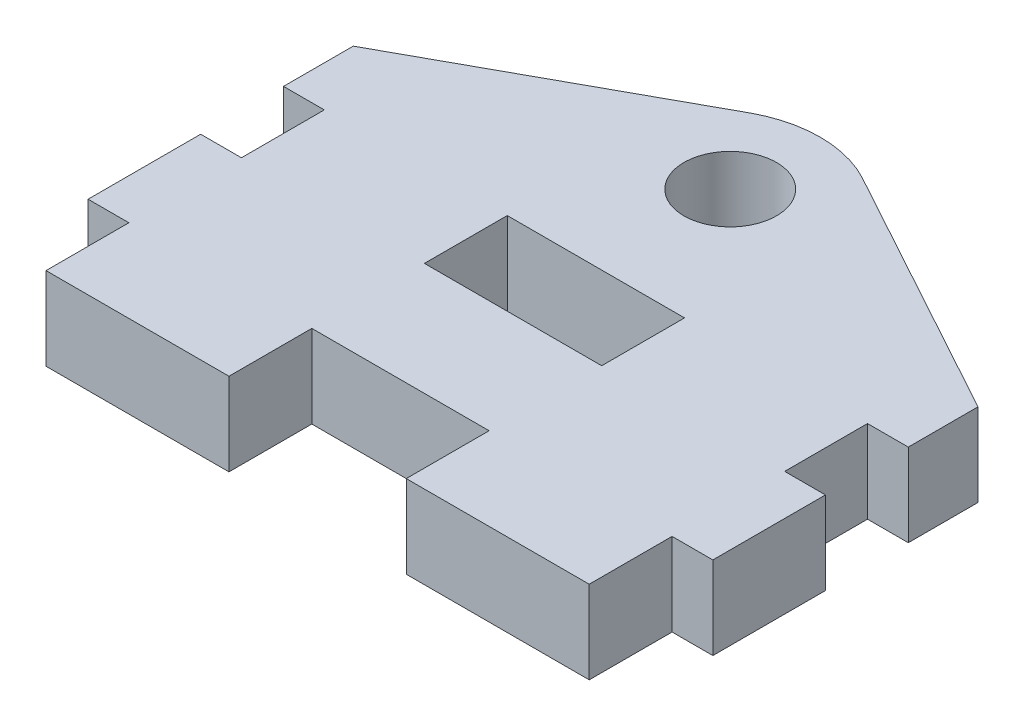
ISO-10303-21;
HEADER;
FILE_DESCRIPTION(('STEP AP214'),'2;1');
FILE_NAME('part.step','',(''),(''),'','','');
FILE_SCHEMA(('AUTOMOTIVE_DESIGN { 1 0 10303 214 1 1 1 1 }'));
ENDSEC;
DATA;
#1=APPLICATION_CONTEXT('core data for automotive mechanical design processes');
#2=APPLICATION_PROTOCOL_DEFINITION('international standard','automotive_design',2000,#1);
#3=PRODUCT_CONTEXT('',#1,'mechanical');
#4=PRODUCT('Part','Part','',(#3));
#5=PRODUCT_RELATED_PRODUCT_CATEGORY('part','',(#4));
#6=PRODUCT_DEFINITION_FORMATION('','',#4);
#7=PRODUCT_DEFINITION_CONTEXT('part definition',#1,'design');
#8=PRODUCT_DEFINITION('design','',#6,#7);
#9=PRODUCT_DEFINITION_SHAPE('','',#8);
#10=(LENGTH_UNIT() NAMED_UNIT(*) SI_UNIT(.MILLI.,.METRE.));
#11=(NAMED_UNIT(*) PLANE_ANGLE_UNIT() SI_UNIT($,.RADIAN.));
#12=(NAMED_UNIT(*) SI_UNIT($,.STERADIAN.) SOLID_ANGLE_UNIT());
#13=UNCERTAINTY_MEASURE_WITH_UNIT(LENGTH_MEASURE(1.E-05),#10,'distance_accuracy_value','');
#14=(GEOMETRIC_REPRESENTATION_CONTEXT(3) GLOBAL_UNCERTAINTY_ASSIGNED_CONTEXT((#13)) GLOBAL_UNIT_ASSIGNED_CONTEXT((#10,
#11,#12)) REPRESENTATION_CONTEXT('',''));
#15=CARTESIAN_POINT('',(0.,0.,0.));
#16=DIRECTION('',(0.,0.,1.));
#17=DIRECTION('',(1.,0.,0.));
#18=AXIS2_PLACEMENT_3D('',#15,#16,#17);
#19=CARTESIAN_POINT('',(-25.6,5.842,-21.2852032988051));
#20=DIRECTION('',(0.,-1.,0.));
#21=DIRECTION('',(0.,0.,-1.));
#22=AXIS2_PLACEMENT_3D('',#19,#20,#21);
#23=PLANE('',#22);
#24=CARTESIAN_POINT('',(-25.6,5.842,-23.2513391840755));
#25=DIRECTION('',(0.,1.,0.));
#26=DIRECTION('',(0.,0.,1.));
#27=AXIS2_PLACEMENT_3D('',#24,#25,#26);
#28=CIRCLE('',#27,3.26389999999999);
#29=CARTESIAN_POINT('',(-25.6,5.842,-19.9874391840755));
#30=VERTEX_POINT('',#29);
#31=EDGE_CURVE('E386',#30,#30,#28,.T.);
#32=ORIENTED_EDGE('',*,*,#31,.F.);
#33=EDGE_LOOP('',(#32));
#34=FACE_BOUND('',#33,.T.);
#35=DIRECTION('',(1.,0.,0.));
#36=VECTOR('',#35,1.);
#37=CARTESIAN_POINT('',(-0.400000000000005,5.842,-13.7795));
#38=LINE('',#37,#36);
#39=CARTESIAN_POINT('',(-6.45,5.842,-13.7795));
#40=VERTEX_POINT('',#39);
#41=CARTESIAN_POINT('',(-3.57499999999999,5.842,-13.7795));
#42=VERTEX_POINT('',#41);
#43=EDGE_CURVE('E352',#40,#42,#38,.T.);
#44=ORIENTED_EDGE('',*,*,#43,.T.);
#45=DIRECTION('',(0.,0.,1.));
#46=VECTOR('',#45,1.);
#47=CARTESIAN_POINT('',(-3.57499999999999,5.842,-13.7795));
#48=LINE('',#47,#46);
#49=CARTESIAN_POINT('',(-3.57499999999999,5.842,-18.6950088034694));
#50=VERTEX_POINT('',#49);
#51=EDGE_CURVE('E205',#50,#42,#48,.T.);
#52=ORIENTED_EDGE('',*,*,#51,.F.);
#53=DIRECTION('',(-0.876884617743926,0.,-0.480700912381169));
#54=VECTOR('',#53,1.);
#55=CARTESIAN_POINT('',(-0.400000000000005,5.842,-16.9545));
#56=LINE('',#55,#54);
#57=CARTESIAN_POINT('',(-21.6024258924648,5.842,-28.577494935667));
#58=VERTEX_POINT('',#57);
#59=EDGE_CURVE('E350',#50,#58,#56,.T.);
#60=ORIENTED_EDGE('',*,*,#59,.T.);
#61=CARTESIAN_POINT('',(-25.6,5.842,-21.2852032988051));
#62=DIRECTION('',(0.,1.,0.));
#63=DIRECTION('',(0.,0.,-1.));
#64=AXIS2_PLACEMENT_3D('',#61,#62,#63);
#65=CIRCLE('',#64,8.31613588527039);
#66=CARTESIAN_POINT('',(-29.5975741075352,5.842,-28.577494935667));
#67=VERTEX_POINT('',#66);
#68=EDGE_CURVE('E348',#58,#67,#65,.T.);
#69=ORIENTED_EDGE('',*,*,#68,.T.);
#70=DIRECTION('',(-0.876884617743927,0.,0.480700912381168));
#71=VECTOR('',#70,1.);
#72=CARTESIAN_POINT('',(-50.8,5.842,-16.9545));
#73=LINE('',#72,#71);
#74=CARTESIAN_POINT('',(-47.625,5.842,-18.6950088034694));
#75=VERTEX_POINT('',#74);
#76=EDGE_CURVE('E345',#67,#75,#73,.T.);
#77=ORIENTED_EDGE('',*,*,#76,.T.);
#78=DIRECTION('',(0.,0.,-1.));
#79=VECTOR('',#78,1.);
#80=CARTESIAN_POINT('',(-47.625,5.842,-13.7795));
#81=LINE('',#80,#79);
#82=CARTESIAN_POINT('',(-47.625,5.842,-13.7795));
#83=VERTEX_POINT('',#82);
#84=EDGE_CURVE('E210',#83,#75,#81,.T.);
#85=ORIENTED_EDGE('',*,*,#84,.F.);
#86=DIRECTION('',(1.,0.,0.));
#87=VECTOR('',#86,1.);
#88=CARTESIAN_POINT('',(-44.75,5.842,-13.7795));
#89=LINE('',#88,#87);
#90=CARTESIAN_POINT('',(-44.75,5.842,-13.7795));
#91=VERTEX_POINT('',#90);
#92=EDGE_CURVE('E343',#83,#91,#89,.T.);
#93=ORIENTED_EDGE('',*,*,#92,.T.);
#94=DIRECTION('',(0.,0.,1.));
#95=VECTOR('',#94,1.);
#96=CARTESIAN_POINT('',(-44.75,5.842,-7.9375));
#97=LINE('',#96,#95);
#98=CARTESIAN_POINT('',(-44.75,5.842,-7.9375));
#99=VERTEX_POINT('',#98);
#100=EDGE_CURVE('E341',#91,#99,#97,.T.);
#101=ORIENTED_EDGE('',*,*,#100,.T.);
#102=DIRECTION('',(-1.,0.,0.));
#103=VECTOR('',#102,1.);
#104=CARTESIAN_POINT('',(-44.75,5.842,-7.9375));
#105=LINE('',#104,#103);
#106=CARTESIAN_POINT('',(-47.625,5.842,-7.93749999999999));
#107=VERTEX_POINT('',#106);
#108=EDGE_CURVE('E338',#99,#107,#105,.T.);
#109=ORIENTED_EDGE('',*,*,#108,.T.);
#110=DIRECTION('',(0.,0.,-1.));
#111=VECTOR('',#110,1.);
#112=CARTESIAN_POINT('',(-47.625,5.842,-7.93749999999999));
#113=LINE('',#112,#111);
#114=CARTESIAN_POINT('',(-47.625,5.842,0.));
#115=VERTEX_POINT('',#114);
#116=EDGE_CURVE('E395',#115,#107,#113,.T.);
#117=ORIENTED_EDGE('',*,*,#116,.F.);
#118=DIRECTION('',(1.,0.,0.));
#119=VECTOR('',#118,1.);
#120=CARTESIAN_POINT('',(-44.75,5.842,0.));
#121=LINE('',#120,#119);
#122=CARTESIAN_POINT('',(-44.75,5.842,0.));
#123=VERTEX_POINT('',#122);
#124=EDGE_CURVE('E336',#115,#123,#121,.T.);
#125=ORIENTED_EDGE('',*,*,#124,.T.);
#126=DIRECTION('',(0.,0.,1.));
#127=VECTOR('',#126,1.);
#128=CARTESIAN_POINT('',(-44.75,5.842,0.));
#129=LINE('',#128,#127);
#130=CARTESIAN_POINT('',(-44.75,5.842,5.842));
#131=VERTEX_POINT('',#130);
#132=EDGE_CURVE('E334',#123,#131,#129,.T.);
#133=ORIENTED_EDGE('',*,*,#132,.T.);
#134=DIRECTION('',(1.,0.,0.));
#135=VECTOR('',#134,1.);
#136=CARTESIAN_POINT('',(-44.75,5.842,5.842));
#137=LINE('',#136,#135);
#138=CARTESIAN_POINT('',(-31.85,5.842,5.842));
#139=VERTEX_POINT('',#138);
#140=EDGE_CURVE('E332',#131,#139,#137,.T.);
#141=ORIENTED_EDGE('',*,*,#140,.T.);
#142=DIRECTION('',(0.,0.,-1.));
#143=VECTOR('',#142,1.);
#144=CARTESIAN_POINT('',(-31.85,5.842,0.));
#145=LINE('',#144,#143);
#146=CARTESIAN_POINT('',(-31.85,5.842,0.));
#147=VERTEX_POINT('',#146);
#148=EDGE_CURVE('E330',#139,#147,#145,.T.);
#149=ORIENTED_EDGE('',*,*,#148,.T.);
#150=DIRECTION('',(1.,0.,0.));
#151=VECTOR('',#150,1.);
#152=CARTESIAN_POINT('',(-19.35,5.842,0.));
#153=LINE('',#152,#151);
#154=CARTESIAN_POINT('',(-19.35,5.842,0.));
#155=VERTEX_POINT('',#154);
#156=EDGE_CURVE('E328',#147,#155,#153,.T.);
#157=ORIENTED_EDGE('',*,*,#156,.T.);
#158=DIRECTION('',(0.,0.,1.));
#159=VECTOR('',#158,1.);
#160=CARTESIAN_POINT('',(-19.35,5.842,0.));
#161=LINE('',#160,#159);
#162=CARTESIAN_POINT('',(-19.35,5.842,5.842));
#163=VERTEX_POINT('',#162);
#164=EDGE_CURVE('E326',#155,#163,#161,.T.);
#165=ORIENTED_EDGE('',*,*,#164,.T.);
#166=DIRECTION('',(1.,0.,0.));
#167=VECTOR('',#166,1.);
#168=CARTESIAN_POINT('',(-6.45,5.842,5.842));
#169=LINE('',#168,#167);
#170=CARTESIAN_POINT('',(-6.45,5.842,5.842));
#171=VERTEX_POINT('',#170);
#172=EDGE_CURVE('E324',#163,#171,#169,.T.);
#173=ORIENTED_EDGE('',*,*,#172,.T.);
#174=DIRECTION('',(0.,0.,-1.));
#175=VECTOR('',#174,1.);
#176=CARTESIAN_POINT('',(-6.45,5.842,0.));
#177=LINE('',#176,#175);
#178=CARTESIAN_POINT('',(-6.45,5.842,0.));
#179=VERTEX_POINT('',#178);
#180=EDGE_CURVE('E322',#171,#179,#177,.T.);
#181=ORIENTED_EDGE('',*,*,#180,.T.);
#182=DIRECTION('',(1.,0.,0.));
#183=VECTOR('',#182,1.);
#184=CARTESIAN_POINT('',(0.,5.842,0.));
#185=LINE('',#184,#183);
#186=CARTESIAN_POINT('',(-3.57500000000001,5.842,0.));
#187=VERTEX_POINT('',#186);
#188=EDGE_CURVE('E269',#179,#187,#185,.T.);
#189=ORIENTED_EDGE('',*,*,#188,.T.);
#190=DIRECTION('',(0.,0.,1.));
#191=VECTOR('',#190,1.);
#192=CARTESIAN_POINT('',(-3.575,5.842,-7.93749999999999));
#193=LINE('',#192,#191);
#194=CARTESIAN_POINT('',(-3.575,5.842,-7.93749999999999));
#195=VERTEX_POINT('',#194);
#196=EDGE_CURVE('E404',#195,#187,#193,.T.);
#197=ORIENTED_EDGE('',*,*,#196,.F.);
#198=DIRECTION('',(-1.,0.,0.));
#199=VECTOR('',#198,1.);
#200=CARTESIAN_POINT('',(0.,5.842,-7.93750000000001));
#201=LINE('',#200,#199);
#202=CARTESIAN_POINT('',(-6.45,5.842,-7.93749999999998));
#203=VERTEX_POINT('',#202);
#204=EDGE_CURVE('E264',#195,#203,#201,.T.);
#205=ORIENTED_EDGE('',*,*,#204,.T.);
#206=DIRECTION('',(0.,0.,-1.));
#207=VECTOR('',#206,1.);
#208=CARTESIAN_POINT('',(-6.45,5.842,-7.93749999999998));
#209=LINE('',#208,#207);
#210=EDGE_CURVE('E307',#203,#40,#209,.T.);
#211=ORIENTED_EDGE('',*,*,#210,.T.);
#212=EDGE_LOOP('',(#44,#52,#60,#69,#77,#85,#93,#101,#109,#117,#125,#133,#141,#149,#157,#165,
#173,#181,#189,#197,#205,#211));
#213=FACE_BOUND('',#212,.T.);
#214=DIRECTION('',(0.,0.,-1.));
#215=VECTOR('',#214,1.);
#216=CARTESIAN_POINT('',(-19.35,5.842,-7.93749999999999));
#217=LINE('',#216,#215);
#218=CARTESIAN_POINT('',(-19.35,5.842,-7.93749999999999));
#219=VERTEX_POINT('',#218);
#220=CARTESIAN_POINT('',(-19.35,5.842,-13.7795));
#221=VERTEX_POINT('',#220);
#222=EDGE_CURVE('E366',#219,#221,#217,.T.);
#223=ORIENTED_EDGE('',*,*,#222,.F.);
#224=DIRECTION('',(1.,0.,0.));
#225=VECTOR('',#224,1.);
#226=CARTESIAN_POINT('',(-19.35,5.842,-7.93749999999999));
#227=LINE('',#226,#225);
#228=CARTESIAN_POINT('',(-31.85,5.842,-7.9375));
#229=VERTEX_POINT('',#228);
#230=EDGE_CURVE('E362',#229,#219,#227,.T.);
#231=ORIENTED_EDGE('',*,*,#230,.F.);
#232=DIRECTION('',(0.,0.,1.));
#233=VECTOR('',#232,1.);
#234=CARTESIAN_POINT('',(-31.85,5.842,-7.9375));
#235=LINE('',#234,#233);
#236=CARTESIAN_POINT('',(-31.85,5.842,-13.7795));
#237=VERTEX_POINT('',#236);
#238=EDGE_CURVE('E378',#237,#229,#235,.T.);
#239=ORIENTED_EDGE('',*,*,#238,.F.);
#240=DIRECTION('',(-1.,0.,0.));
#241=VECTOR('',#240,1.);
#242=CARTESIAN_POINT('',(-19.35,5.842,-13.7795));
#243=LINE('',#242,#241);
#244=EDGE_CURVE('E381',#221,#237,#243,.T.);
#245=ORIENTED_EDGE('',*,*,#244,.F.);
#246=EDGE_LOOP('',(#223,#231,#239,#245));
#247=FACE_BOUND('',#246,.T.);
#248=ADVANCED_FACE('F32',(#34,#213,#247),#23,.F.);
#249=CARTESIAN_POINT('',(-25.6,0.,-21.2852032988051));
#250=DIRECTION('',(0.,-1.,0.));
#251=DIRECTION('',(0.,0.,-1.));
#252=AXIS2_PLACEMENT_3D('',#249,#250,#251);
#253=PLANE('',#252);
#254=DIRECTION('',(0.,0.,1.));
#255=VECTOR('',#254,1.);
#256=CARTESIAN_POINT('',(-3.57499999999999,0.,-13.7795));
#257=LINE('',#256,#255);
#258=CARTESIAN_POINT('',(-3.575,0.,-18.6950088034694));
#259=VERTEX_POINT('',#258);
#260=CARTESIAN_POINT('',(-3.57499999999999,0.,-13.7795));
#261=VERTEX_POINT('',#260);
#262=EDGE_CURVE('E47',#259,#261,#257,.T.);
#263=ORIENTED_EDGE('',*,*,#262,.T.);
#264=DIRECTION('',(1.,0.,0.));
#265=VECTOR('',#264,1.);
#266=CARTESIAN_POINT('',(-0.400000000000005,0.,-13.7795));
#267=LINE('',#266,#265);
#268=CARTESIAN_POINT('',(-6.45,0.,-13.7795));
#269=VERTEX_POINT('',#268);
#270=EDGE_CURVE('E218',#269,#261,#267,.T.);
#271=ORIENTED_EDGE('',*,*,#270,.F.);
#272=DIRECTION('',(0.,0.,-1.));
#273=VECTOR('',#272,1.);
#274=CARTESIAN_POINT('',(-6.45,0.,-7.93749999999998));
#275=LINE('',#274,#273);
#276=CARTESIAN_POINT('',(-6.45,0.,-7.93749999999998));
#277=VERTEX_POINT('',#276);
#278=EDGE_CURVE('E226',#277,#269,#275,.T.);
#279=ORIENTED_EDGE('',*,*,#278,.F.);
#280=DIRECTION('',(-1.,0.,0.));
#281=VECTOR('',#280,1.);
#282=CARTESIAN_POINT('',(0.,0.,-7.93750000000001));
#283=LINE('',#282,#281);
#284=CARTESIAN_POINT('',(-3.575,0.,-7.93749999999999));
#285=VERTEX_POINT('',#284);
#286=EDGE_CURVE('E230',#285,#277,#283,.T.);
#287=ORIENTED_EDGE('',*,*,#286,.F.);
#288=DIRECTION('',(0.,0.,1.));
#289=VECTOR('',#288,1.);
#290=CARTESIAN_POINT('',(-3.575,0.,-7.93749999999999));
#291=LINE('',#290,#289);
#292=CARTESIAN_POINT('',(-3.57500000000001,0.,0.));
#293=VERTEX_POINT('',#292);
#294=EDGE_CURVE('E313',#285,#293,#291,.T.);
#295=ORIENTED_EDGE('',*,*,#294,.T.);
#296=DIRECTION('',(1.,0.,0.));
#297=VECTOR('',#296,1.);
#298=CARTESIAN_POINT('',(0.,0.,0.));
#299=LINE('',#298,#297);
#300=CARTESIAN_POINT('',(-6.45,0.,0.));
#301=VERTEX_POINT('',#300);
#302=EDGE_CURVE('E261',#301,#293,#299,.T.);
#303=ORIENTED_EDGE('',*,*,#302,.F.);
#304=DIRECTION('',(0.,0.,-1.));
#305=VECTOR('',#304,1.);
#306=CARTESIAN_POINT('',(-6.45,0.,0.));
#307=LINE('',#306,#305);
#308=CARTESIAN_POINT('',(-6.45,0.,5.842));
#309=VERTEX_POINT('',#308);
#310=EDGE_CURVE('E259',#309,#301,#307,.T.);
#311=ORIENTED_EDGE('',*,*,#310,.F.);
#312=DIRECTION('',(1.,0.,0.));
#313=VECTOR('',#312,1.);
#314=CARTESIAN_POINT('',(-6.45,0.,5.842));
#315=LINE('',#314,#313);
#316=CARTESIAN_POINT('',(-19.35,0.,5.842));
#317=VERTEX_POINT('',#316);
#318=EDGE_CURVE('E257',#317,#309,#315,.T.);
#319=ORIENTED_EDGE('',*,*,#318,.F.);
#320=DIRECTION('',(0.,0.,1.));
#321=VECTOR('',#320,1.);
#322=CARTESIAN_POINT('',(-19.35,0.,0.));
#323=LINE('',#322,#321);
#324=CARTESIAN_POINT('',(-19.35,0.,0.));
#325=VERTEX_POINT('',#324);
#326=EDGE_CURVE('E255',#325,#317,#323,.T.);
#327=ORIENTED_EDGE('',*,*,#326,.F.);
#328=DIRECTION('',(1.,0.,0.));
#329=VECTOR('',#328,1.);
#330=CARTESIAN_POINT('',(-19.35,0.,0.));
#331=LINE('',#330,#329);
#332=CARTESIAN_POINT('',(-31.85,0.,0.));
#333=VERTEX_POINT('',#332);
#334=EDGE_CURVE('E253',#333,#325,#331,.T.);
#335=ORIENTED_EDGE('',*,*,#334,.F.);
#336=DIRECTION('',(0.,0.,-1.));
#337=VECTOR('',#336,1.);
#338=CARTESIAN_POINT('',(-31.85,0.,0.));
#339=LINE('',#338,#337);
#340=CARTESIAN_POINT('',(-31.85,0.,5.842));
#341=VERTEX_POINT('',#340);
#342=EDGE_CURVE('E251',#341,#333,#339,.T.);
#343=ORIENTED_EDGE('',*,*,#342,.F.);
#344=DIRECTION('',(1.,0.,0.));
#345=VECTOR('',#344,1.);
#346=CARTESIAN_POINT('',(-44.75,0.,5.842));
#347=LINE('',#346,#345);
#348=CARTESIAN_POINT('',(-44.75,0.,5.842));
#349=VERTEX_POINT('',#348);
#350=EDGE_CURVE('E249',#349,#341,#347,.T.);
#351=ORIENTED_EDGE('',*,*,#350,.F.);
#352=DIRECTION('',(0.,0.,1.));
#353=VECTOR('',#352,1.);
#354=CARTESIAN_POINT('',(-44.75,0.,0.));
#355=LINE('',#354,#353);
#356=CARTESIAN_POINT('',(-44.75,0.,0.));
#357=VERTEX_POINT('',#356);
#358=EDGE_CURVE('E247',#357,#349,#355,.T.);
#359=ORIENTED_EDGE('',*,*,#358,.F.);
#360=DIRECTION('',(1.,0.,0.));
#361=VECTOR('',#360,1.);
#362=CARTESIAN_POINT('',(-44.75,0.,0.));
#363=LINE('',#362,#361);
#364=CARTESIAN_POINT('',(-47.625,0.,0.));
#365=VERTEX_POINT('',#364);
#366=EDGE_CURVE('E245',#365,#357,#363,.T.);
#367=ORIENTED_EDGE('',*,*,#366,.F.);
#368=DIRECTION('',(0.,0.,-1.));
#369=VECTOR('',#368,1.);
#370=CARTESIAN_POINT('',(-47.625,0.,-7.93749999999999));
#371=LINE('',#370,#369);
#372=CARTESIAN_POINT('',(-47.625,0.,-7.93749999999999));
#373=VERTEX_POINT('',#372);
#374=EDGE_CURVE('E392',#365,#373,#371,.T.);
#375=ORIENTED_EDGE('',*,*,#374,.T.);
#376=DIRECTION('',(-1.,0.,0.));
#377=VECTOR('',#376,1.);
#378=CARTESIAN_POINT('',(-44.75,0.,-7.9375));
#379=LINE('',#378,#377);
#380=CARTESIAN_POINT('',(-44.75,0.,-7.9375));
#381=VERTEX_POINT('',#380);
#382=EDGE_CURVE('E242',#381,#373,#379,.T.);
#383=ORIENTED_EDGE('',*,*,#382,.F.);
#384=DIRECTION('',(0.,0.,1.));
#385=VECTOR('',#384,1.);
#386=CARTESIAN_POINT('',(-44.75,0.,-7.9375));
#387=LINE('',#386,#385);
#388=CARTESIAN_POINT('',(-44.75,0.,-13.7795));
#389=VERTEX_POINT('',#388);
#390=EDGE_CURVE('E240',#389,#381,#387,.T.);
#391=ORIENTED_EDGE('',*,*,#390,.F.);
#392=DIRECTION('',(1.,0.,0.));
#393=VECTOR('',#392,1.);
#394=CARTESIAN_POINT('',(-44.75,0.,-13.7795));
#395=LINE('',#394,#393);
#396=CARTESIAN_POINT('',(-47.625,0.,-13.7795));
#397=VERTEX_POINT('',#396);
#398=EDGE_CURVE('E238',#397,#389,#395,.T.);
#399=ORIENTED_EDGE('',*,*,#398,.F.);
#400=DIRECTION('',(0.,0.,-1.));
#401=VECTOR('',#400,1.);
#402=CARTESIAN_POINT('',(-47.625,0.,-13.7795));
#403=LINE('',#402,#401);
#404=CARTESIAN_POINT('',(-47.625,0.,-18.6950088034694));
#405=VERTEX_POINT('',#404);
#406=EDGE_CURVE('E54',#397,#405,#403,.T.);
#407=ORIENTED_EDGE('',*,*,#406,.T.);
#408=DIRECTION('',(-0.876884617743927,0.,0.480700912381168));
#409=VECTOR('',#408,1.);
#410=CARTESIAN_POINT('',(-50.8,0.,-16.9545));
#411=LINE('',#410,#409);
#412=CARTESIAN_POINT('',(-29.5975741075352,0.,-28.577494935667));
#413=VERTEX_POINT('',#412);
#414=EDGE_CURVE('E235',#413,#405,#411,.T.);
#415=ORIENTED_EDGE('',*,*,#414,.F.);
#416=CARTESIAN_POINT('',(-25.6,0.,-21.2852032988051));
#417=DIRECTION('',(0.,1.,0.));
#418=DIRECTION('',(0.,0.,-1.));
#419=AXIS2_PLACEMENT_3D('',#416,#417,#418);
#420=CIRCLE('',#419,8.31613588527039);
#421=CARTESIAN_POINT('',(-21.6024258924648,0.,-28.577494935667));
#422=VERTEX_POINT('',#421);
#423=EDGE_CURVE('E228',#422,#413,#420,.T.);
#424=ORIENTED_EDGE('',*,*,#423,.F.);
#425=DIRECTION('',(-0.876884617743926,0.,-0.480700912381169));
#426=VECTOR('',#425,1.);
#427=CARTESIAN_POINT('',(-0.400000000000005,0.,-16.9545));
#428=LINE('',#427,#426);
#429=EDGE_CURVE('E220',#259,#422,#428,.T.);
#430=ORIENTED_EDGE('',*,*,#429,.F.);
#431=EDGE_LOOP('',(#263,#271,#279,#287,#295,#303,#311,#319,#327,#335,#343,#351,#359,#367,#375,
#383,#391,#399,#407,#415,#424,#430));
#432=FACE_BOUND('',#431,.T.);
#433=CARTESIAN_POINT('',(-25.6,0.,-23.2513391840755));
#434=DIRECTION('',(0.,1.,0.));
#435=DIRECTION('',(0.,0.,1.));
#436=AXIS2_PLACEMENT_3D('',#433,#434,#435);
#437=CIRCLE('',#436,3.2639);
#438=CARTESIAN_POINT('',(-25.6,0.,-19.9874391840755));
#439=VERTEX_POINT('',#438);
#440=EDGE_CURVE('E376',#439,#439,#437,.T.);
#441=ORIENTED_EDGE('',*,*,#440,.T.);
#442=EDGE_LOOP('',(#441));
#443=FACE_BOUND('',#442,.T.);
#444=DIRECTION('',(1.,0.,0.));
#445=VECTOR('',#444,1.);
#446=CARTESIAN_POINT('',(-19.35,0.,-7.93749999999999));
#447=LINE('',#446,#445);
#448=CARTESIAN_POINT('',(-31.85,0.,-7.9375));
#449=VERTEX_POINT('',#448);
#450=CARTESIAN_POINT('',(-19.35,0.,-7.93749999999999));
#451=VERTEX_POINT('',#450);
#452=EDGE_CURVE('E363',#449,#451,#447,.T.);
#453=ORIENTED_EDGE('',*,*,#452,.T.);
#454=DIRECTION('',(0.,0.,-1.));
#455=VECTOR('',#454,1.);
#456=CARTESIAN_POINT('',(-19.35,0.,-7.93749999999999));
#457=LINE('',#456,#455);
#458=CARTESIAN_POINT('',(-19.35,0.,-13.7795));
#459=VERTEX_POINT('',#458);
#460=EDGE_CURVE('E373',#451,#459,#457,.T.);
#461=ORIENTED_EDGE('',*,*,#460,.T.);
#462=DIRECTION('',(-1.,0.,0.));
#463=VECTOR('',#462,1.);
#464=CARTESIAN_POINT('',(-19.35,0.,-13.7795));
#465=LINE('',#464,#463);
#466=CARTESIAN_POINT('',(-31.85,0.,-13.7795));
#467=VERTEX_POINT('',#466);
#468=EDGE_CURVE('E370',#459,#467,#465,.T.);
#469=ORIENTED_EDGE('',*,*,#468,.T.);
#470=DIRECTION('',(0.,0.,1.));
#471=VECTOR('',#470,1.);
#472=CARTESIAN_POINT('',(-31.85,0.,-7.9375));
#473=LINE('',#472,#471);
#474=EDGE_CURVE('E367',#467,#449,#473,.T.);
#475=ORIENTED_EDGE('',*,*,#474,.T.);
#476=EDGE_LOOP('',(#453,#461,#469,#475));
#477=FACE_BOUND('',#476,.T.);
#478=ADVANCED_FACE('F215',(#432,#443,#477),#253,.T.);
#479=CARTESIAN_POINT('',(0.,5.842,-7.93750000000001));
#480=DIRECTION('',(0.,0.,1.));
#481=DIRECTION('',(1.,0.,0.));
#482=AXIS2_PLACEMENT_3D('',#479,#480,#481);
#483=PLANE('',#482);
#484=ORIENTED_EDGE('',*,*,#204,.F.);
#485=DIRECTION('',(0.,1.,0.));
#486=VECTOR('',#485,1.);
#487=CARTESIAN_POINT('',(-3.575,0.,-7.93749999999999));
#488=LINE('',#487,#486);
#489=EDGE_CURVE('E400',#285,#195,#488,.T.);
#490=ORIENTED_EDGE('',*,*,#489,.F.);
#491=ORIENTED_EDGE('',*,*,#286,.T.);
#492=DIRECTION('',(0.,-1.,0.));
#493=VECTOR('',#492,1.);
#494=CARTESIAN_POINT('',(-6.45,5.842,-7.93749999999998));
#495=LINE('',#494,#493);
#496=EDGE_CURVE('E40',#203,#277,#495,.T.);
#497=ORIENTED_EDGE('',*,*,#496,.F.);
#498=EDGE_LOOP('',(#484,#490,#491,#497));
#499=FACE_BOUND('',#498,.T.);
#500=ADVANCED_FACE('F34',(#499),#483,.F.);
#501=CARTESIAN_POINT('',(-6.45,5.842,-7.93749999999998));
#502=DIRECTION('',(-1.,0.,0.));
#503=DIRECTION('',(0.,0.,1.));
#504=AXIS2_PLACEMENT_3D('',#501,#502,#503);
#505=PLANE('',#504);
#506=ORIENTED_EDGE('',*,*,#278,.T.);
#507=DIRECTION('',(0.,-1.,0.));
#508=VECTOR('',#507,1.);
#509=CARTESIAN_POINT('',(-6.45,5.842,-13.7795));
#510=LINE('',#509,#508);
#511=EDGE_CURVE('E225',#40,#269,#510,.T.);
#512=ORIENTED_EDGE('',*,*,#511,.F.);
#513=ORIENTED_EDGE('',*,*,#210,.F.);
#514=ORIENTED_EDGE('',*,*,#496,.T.);
#515=EDGE_LOOP('',(#506,#512,#513,#514));
#516=FACE_BOUND('',#515,.T.);
#517=ADVANCED_FACE('F306',(#516),#505,.F.);
#518=CARTESIAN_POINT('',(-0.400000000000005,5.842,-13.7795));
#519=DIRECTION('',(0.,0.,-1.));
#520=DIRECTION('',(-1.,0.,0.));
#521=AXIS2_PLACEMENT_3D('',#518,#519,#520);
#522=PLANE('',#521);
#523=ORIENTED_EDGE('',*,*,#270,.T.);
#524=DIRECTION('',(0.,1.,0.));
#525=VECTOR('',#524,1.);
#526=CARTESIAN_POINT('',(-3.57499999999999,0.,-13.7795));
#527=LINE('',#526,#525);
#528=EDGE_CURVE('E202',#261,#42,#527,.T.);
#529=ORIENTED_EDGE('',*,*,#528,.T.);
#530=ORIENTED_EDGE('',*,*,#43,.F.);
#531=ORIENTED_EDGE('',*,*,#511,.T.);
#532=EDGE_LOOP('',(#523,#529,#530,#531));
#533=FACE_BOUND('',#532,.T.);
#534=ADVANCED_FACE('F223',(#533),#522,.F.);
#535=CARTESIAN_POINT('',(-0.400000000000005,5.842,-16.9545));
#536=DIRECTION('',(-0.480700912381169,0.,0.876884617743926));
#537=DIRECTION('',(0.876884617743927,0.,0.480700912381169));
#538=AXIS2_PLACEMENT_3D('',#535,#536,#537);
#539=PLANE('',#538);
#540=ORIENTED_EDGE('',*,*,#59,.F.);
#541=DIRECTION('',(0.,-1.,0.));
#542=VECTOR('',#541,1.);
#543=CARTESIAN_POINT('',(-3.57499999999999,5.842,-18.6950088034694));
#544=LINE('',#543,#542);
#545=EDGE_CURVE('E11',#50,#259,#544,.T.);
#546=ORIENTED_EDGE('',*,*,#545,.T.);
#547=ORIENTED_EDGE('',*,*,#429,.T.);
#548=DIRECTION('',(0.,-1.,0.));
#549=VECTOR('',#548,1.);
#550=CARTESIAN_POINT('',(-21.6024258924648,5.842,-28.577494935667));
#551=LINE('',#550,#549);
#552=EDGE_CURVE('E299',#58,#422,#551,.T.);
#553=ORIENTED_EDGE('',*,*,#552,.F.);
#554=EDGE_LOOP('',(#540,#546,#547,#553));
#555=FACE_BOUND('',#554,.T.);
#556=ADVANCED_FACE('F427',(#555),#539,.F.);
#557=CARTESIAN_POINT('',(-25.6,5.842,-21.2852032988051));
#558=DIRECTION('',(0.,-1.,0.));
#559=DIRECTION('',(0.,0.,-1.));
#560=AXIS2_PLACEMENT_3D('',#557,#558,#559);
#561=CYLINDRICAL_SURFACE('',#560,8.31613588527039);
#562=ORIENTED_EDGE('',*,*,#423,.T.);
#563=DIRECTION('',(0.,-1.,0.));
#564=VECTOR('',#563,1.);
#565=CARTESIAN_POINT('',(-29.5975741075352,5.842,-28.577494935667));
#566=LINE('',#565,#564);
#567=EDGE_CURVE('E296',#67,#413,#566,.T.);
#568=ORIENTED_EDGE('',*,*,#567,.F.);
#569=ORIENTED_EDGE('',*,*,#68,.F.);
#570=ORIENTED_EDGE('',*,*,#552,.T.);
#571=EDGE_LOOP('',(#562,#568,#569,#570));
#572=FACE_BOUND('',#571,.T.);
#573=ADVANCED_FACE('F423',(#572),#561,.T.);
#574=CARTESIAN_POINT('',(-50.8,5.842,-16.9545));
#575=DIRECTION('',(0.480700912381168,0.,0.876884617743927));
#576=DIRECTION('',(0.876884617743927,0.,-0.480700912381168));
#577=AXIS2_PLACEMENT_3D('',#574,#575,#576);
#578=PLANE('',#577);
#579=ORIENTED_EDGE('',*,*,#414,.T.);
#580=DIRECTION('',(0.,1.,0.));
#581=VECTOR('',#580,1.);
#582=CARTESIAN_POINT('',(-47.625,5.842,-18.6950088034694));
#583=LINE('',#582,#581);
#584=EDGE_CURVE('E406',#405,#75,#583,.T.);
#585=ORIENTED_EDGE('',*,*,#584,.T.);
#586=ORIENTED_EDGE('',*,*,#76,.F.);
#587=ORIENTED_EDGE('',*,*,#567,.T.);
#588=EDGE_LOOP('',(#579,#585,#586,#587));
#589=FACE_BOUND('',#588,.T.);
#590=ADVANCED_FACE('F418',(#589),#578,.F.);
#591=CARTESIAN_POINT('',(-44.75,5.842,-13.7795));
#592=DIRECTION('',(0.,0.,-1.));
#593=DIRECTION('',(-1.,0.,0.));
#594=AXIS2_PLACEMENT_3D('',#591,#592,#593);
#595=PLANE('',#594);
#596=ORIENTED_EDGE('',*,*,#92,.F.);
#597=DIRECTION('',(0.,1.,0.));
#598=VECTOR('',#597,1.);
#599=CARTESIAN_POINT('',(-47.625,0.,-13.7795));
#600=LINE('',#599,#598);
#601=EDGE_CURVE('E410',#397,#83,#600,.T.);
#602=ORIENTED_EDGE('',*,*,#601,.F.);
#603=ORIENTED_EDGE('',*,*,#398,.T.);
#604=DIRECTION('',(0.,-1.,0.));
#605=VECTOR('',#604,1.);
#606=CARTESIAN_POINT('',(-44.75,5.842,-13.7795));
#607=LINE('',#606,#605);
#608=EDGE_CURVE('E293',#91,#389,#607,.T.);
#609=ORIENTED_EDGE('',*,*,#608,.F.);
#610=EDGE_LOOP('',(#596,#602,#603,#609));
#611=FACE_BOUND('',#610,.T.);
#612=ADVANCED_FACE('F491',(#611),#595,.F.);
#613=CARTESIAN_POINT('',(-44.75,5.842,-7.9375));
#614=DIRECTION('',(1.,0.,0.));
#615=DIRECTION('',(0.,0.,-1.));
#616=AXIS2_PLACEMENT_3D('',#613,#614,#615);
#617=PLANE('',#616);
#618=ORIENTED_EDGE('',*,*,#390,.T.);
#619=DIRECTION('',(0.,-1.,0.));
#620=VECTOR('',#619,1.);
#621=CARTESIAN_POINT('',(-44.75,5.842,-7.9375));
#622=LINE('',#621,#620);
#623=EDGE_CURVE('E290',#99,#381,#622,.T.);
#624=ORIENTED_EDGE('',*,*,#623,.F.);
#625=ORIENTED_EDGE('',*,*,#100,.F.);
#626=ORIENTED_EDGE('',*,*,#608,.T.);
#627=EDGE_LOOP('',(#618,#624,#625,#626));
#628=FACE_BOUND('',#627,.T.);
#629=ADVANCED_FACE('F487',(#628),#617,.F.);
#630=CARTESIAN_POINT('',(-44.75,5.842,-7.9375));
#631=DIRECTION('',(0.,0.,1.));
#632=DIRECTION('',(1.,0.,0.));
#633=AXIS2_PLACEMENT_3D('',#630,#631,#632);
#634=PLANE('',#633);
#635=ORIENTED_EDGE('',*,*,#382,.T.);
#636=DIRECTION('',(0.,1.,0.));
#637=VECTOR('',#636,1.);
#638=CARTESIAN_POINT('',(-47.625,0.,-7.93749999999999));
#639=LINE('',#638,#637);
#640=EDGE_CURVE('E389',#373,#107,#639,.T.);
#641=ORIENTED_EDGE('',*,*,#640,.T.);
#642=ORIENTED_EDGE('',*,*,#108,.F.);
#643=ORIENTED_EDGE('',*,*,#623,.T.);
#644=EDGE_LOOP('',(#635,#641,#642,#643));
#645=FACE_BOUND('',#644,.T.);
#646=ADVANCED_FACE('F485',(#645),#634,.F.);
#647=CARTESIAN_POINT('',(-44.75,5.842,0.));
#648=DIRECTION('',(0.,0.,-1.));
#649=DIRECTION('',(-1.,0.,0.));
#650=AXIS2_PLACEMENT_3D('',#647,#648,#649);
#651=PLANE('',#650);
#652=ORIENTED_EDGE('',*,*,#124,.F.);
#653=DIRECTION('',(0.,1.,0.));
#654=VECTOR('',#653,1.);
#655=CARTESIAN_POINT('',(-47.625,0.,0.));
#656=LINE('',#655,#654);
#657=EDGE_CURVE('E390',#365,#115,#656,.T.);
#658=ORIENTED_EDGE('',*,*,#657,.F.);
#659=ORIENTED_EDGE('',*,*,#366,.T.);
#660=DIRECTION('',(0.,-1.,0.));
#661=VECTOR('',#660,1.);
#662=CARTESIAN_POINT('',(-44.75,5.842,0.));
#663=LINE('',#662,#661);
#664=EDGE_CURVE('E287',#123,#357,#663,.T.);
#665=ORIENTED_EDGE('',*,*,#664,.F.);
#666=EDGE_LOOP('',(#652,#658,#659,#665));
#667=FACE_BOUND('',#666,.T.);
#668=ADVANCED_FACE('F477',(#667),#651,.F.);
#669=CARTESIAN_POINT('',(-44.75,5.842,0.));
#670=DIRECTION('',(1.,0.,0.));
#671=DIRECTION('',(0.,0.,-1.));
#672=AXIS2_PLACEMENT_3D('',#669,#670,#671);
#673=PLANE('',#672);
#674=ORIENTED_EDGE('',*,*,#358,.T.);
#675=DIRECTION('',(0.,-1.,0.));
#676=VECTOR('',#675,1.);
#677=CARTESIAN_POINT('',(-44.75,5.842,5.842));
#678=LINE('',#677,#676);
#679=EDGE_CURVE('E284',#131,#349,#678,.T.);
#680=ORIENTED_EDGE('',*,*,#679,.F.);
#681=ORIENTED_EDGE('',*,*,#132,.F.);
#682=ORIENTED_EDGE('',*,*,#664,.T.);
#683=EDGE_LOOP('',(#674,#680,#681,#682));
#684=FACE_BOUND('',#683,.T.);
#685=ADVANCED_FACE('F470',(#684),#673,.F.);
#686=CARTESIAN_POINT('',(-44.75,5.842,5.842));
#687=DIRECTION('',(0.,0.,-1.));
#688=DIRECTION('',(-1.,0.,0.));
#689=AXIS2_PLACEMENT_3D('',#686,#687,#688);
#690=PLANE('',#689);
#691=ORIENTED_EDGE('',*,*,#350,.T.);
#692=DIRECTION('',(0.,-1.,0.));
#693=VECTOR('',#692,1.);
#694=CARTESIAN_POINT('',(-31.85,5.842,5.842));
#695=LINE('',#694,#693);
#696=EDGE_CURVE('E281',#139,#341,#695,.T.);
#697=ORIENTED_EDGE('',*,*,#696,.F.);
#698=ORIENTED_EDGE('',*,*,#140,.F.);
#699=ORIENTED_EDGE('',*,*,#679,.T.);
#700=EDGE_LOOP('',(#691,#697,#698,#699));
#701=FACE_BOUND('',#700,.T.);
#702=ADVANCED_FACE('F466',(#701),#690,.F.);
#703=CARTESIAN_POINT('',(-31.85,5.842,0.));
#704=DIRECTION('',(-1.,0.,0.));
#705=DIRECTION('',(0.,0.,1.));
#706=AXIS2_PLACEMENT_3D('',#703,#704,#705);
#707=PLANE('',#706);
#708=ORIENTED_EDGE('',*,*,#342,.T.);
#709=DIRECTION('',(0.,-1.,0.));
#710=VECTOR('',#709,1.);
#711=CARTESIAN_POINT('',(-31.85,5.842,0.));
#712=LINE('',#711,#710);
#713=EDGE_CURVE('E278',#147,#333,#712,.T.);
#714=ORIENTED_EDGE('',*,*,#713,.F.);
#715=ORIENTED_EDGE('',*,*,#148,.F.);
#716=ORIENTED_EDGE('',*,*,#696,.T.);
#717=EDGE_LOOP('',(#708,#714,#715,#716));
#718=FACE_BOUND('',#717,.T.);
#719=ADVANCED_FACE('F461',(#718),#707,.F.);
#720=CARTESIAN_POINT('',(-19.35,5.842,0.));
#721=DIRECTION('',(0.,0.,-1.));
#722=DIRECTION('',(-1.,0.,0.));
#723=AXIS2_PLACEMENT_3D('',#720,#721,#722);
#724=PLANE('',#723);
#725=ORIENTED_EDGE('',*,*,#334,.T.);
#726=DIRECTION('',(0.,-1.,0.));
#727=VECTOR('',#726,1.);
#728=CARTESIAN_POINT('',(-19.35,5.842,0.));
#729=LINE('',#728,#727);
#730=EDGE_CURVE('E275',#155,#325,#729,.T.);
#731=ORIENTED_EDGE('',*,*,#730,.F.);
#732=ORIENTED_EDGE('',*,*,#156,.F.);
#733=ORIENTED_EDGE('',*,*,#713,.T.);
#734=EDGE_LOOP('',(#725,#731,#732,#733));
#735=FACE_BOUND('',#734,.T.);
#736=ADVANCED_FACE('F455',(#735),#724,.F.);
#737=CARTESIAN_POINT('',(-19.35,5.842,0.));
#738=DIRECTION('',(1.,0.,0.));
#739=DIRECTION('',(0.,0.,-1.));
#740=AXIS2_PLACEMENT_3D('',#737,#738,#739);
#741=PLANE('',#740);
#742=ORIENTED_EDGE('',*,*,#326,.T.);
#743=DIRECTION('',(0.,-1.,0.));
#744=VECTOR('',#743,1.);
#745=CARTESIAN_POINT('',(-19.35,5.842,5.842));
#746=LINE('',#745,#744);
#747=EDGE_CURVE('E272',#163,#317,#746,.T.);
#748=ORIENTED_EDGE('',*,*,#747,.F.);
#749=ORIENTED_EDGE('',*,*,#164,.F.);
#750=ORIENTED_EDGE('',*,*,#730,.T.);
#751=EDGE_LOOP('',(#742,#748,#749,#750));
#752=FACE_BOUND('',#751,.T.);
#753=ADVANCED_FACE('F451',(#752),#741,.F.);
#754=CARTESIAN_POINT('',(-6.45,5.842,5.842));
#755=DIRECTION('',(0.,0.,-1.));
#756=DIRECTION('',(-1.,0.,0.));
#757=AXIS2_PLACEMENT_3D('',#754,#755,#756);
#758=PLANE('',#757);
#759=ORIENTED_EDGE('',*,*,#318,.T.);
#760=DIRECTION('',(0.,-1.,0.));
#761=VECTOR('',#760,1.);
#762=CARTESIAN_POINT('',(-6.45,5.842,5.842));
#763=LINE('',#762,#761);
#764=EDGE_CURVE('E268',#171,#309,#763,.T.);
#765=ORIENTED_EDGE('',*,*,#764,.F.);
#766=ORIENTED_EDGE('',*,*,#172,.F.);
#767=ORIENTED_EDGE('',*,*,#747,.T.);
#768=EDGE_LOOP('',(#759,#765,#766,#767));
#769=FACE_BOUND('',#768,.T.);
#770=ADVANCED_FACE('F447',(#769),#758,.F.);
#771=CARTESIAN_POINT('',(-6.45,5.842,0.));
#772=DIRECTION('',(-1.,0.,0.));
#773=DIRECTION('',(0.,0.,1.));
#774=AXIS2_PLACEMENT_3D('',#771,#772,#773);
#775=PLANE('',#774);
#776=ORIENTED_EDGE('',*,*,#310,.T.);
#777=DIRECTION('',(0.,-1.,0.));
#778=VECTOR('',#777,1.);
#779=CARTESIAN_POINT('',(-6.45,5.842,0.));
#780=LINE('',#779,#778);
#781=EDGE_CURVE('E265',#179,#301,#780,.T.);
#782=ORIENTED_EDGE('',*,*,#781,.F.);
#783=ORIENTED_EDGE('',*,*,#180,.F.);
#784=ORIENTED_EDGE('',*,*,#764,.T.);
#785=EDGE_LOOP('',(#776,#782,#783,#784));
#786=FACE_BOUND('',#785,.T.);
#787=ADVANCED_FACE('F441',(#786),#775,.F.);
#788=CARTESIAN_POINT('',(0.,5.842,0.));
#789=DIRECTION('',(0.,0.,-1.));
#790=DIRECTION('',(-1.,0.,0.));
#791=AXIS2_PLACEMENT_3D('',#788,#789,#790);
#792=PLANE('',#791);
#793=ORIENTED_EDGE('',*,*,#302,.T.);
#794=DIRECTION('',(0.,1.,0.));
#795=VECTOR('',#794,1.);
#796=CARTESIAN_POINT('',(-3.57500000000001,0.,0.));
#797=LINE('',#796,#795);
#798=EDGE_CURVE('E397',#293,#187,#797,.T.);
#799=ORIENTED_EDGE('',*,*,#798,.T.);
#800=ORIENTED_EDGE('',*,*,#188,.F.);
#801=ORIENTED_EDGE('',*,*,#781,.T.);
#802=EDGE_LOOP('',(#793,#799,#800,#801));
#803=FACE_BOUND('',#802,.T.);
#804=ADVANCED_FACE('F435',(#803),#792,.F.);
#805=CARTESIAN_POINT('',(-19.35,5.842,-7.93749999999999));
#806=DIRECTION('',(-1.,0.,0.));
#807=DIRECTION('',(0.,0.,1.));
#808=AXIS2_PLACEMENT_3D('',#805,#806,#807);
#809=PLANE('',#808);
#810=ORIENTED_EDGE('',*,*,#460,.F.);
#811=DIRECTION('',(0.,-1.,0.));
#812=VECTOR('',#811,1.);
#813=CARTESIAN_POINT('',(-19.35,5.842,-7.93749999999999));
#814=LINE('',#813,#812);
#815=EDGE_CURVE('E359',#219,#451,#814,.T.);
#816=ORIENTED_EDGE('',*,*,#815,.F.);
#817=ORIENTED_EDGE('',*,*,#222,.T.);
#818=DIRECTION('',(0.,-1.,0.));
#819=VECTOR('',#818,1.);
#820=CARTESIAN_POINT('',(-19.35,5.842,-13.7795));
#821=LINE('',#820,#819);
#822=EDGE_CURVE('E315',#221,#459,#821,.T.);
#823=ORIENTED_EDGE('',*,*,#822,.T.);
#824=EDGE_LOOP('',(#810,#816,#817,#823));
#825=FACE_BOUND('',#824,.T.);
#826=ADVANCED_FACE('F511',(#825),#809,.T.);
#827=CARTESIAN_POINT('',(-19.35,5.842,-13.7795));
#828=DIRECTION('',(0.,0.,1.));
#829=DIRECTION('',(1.,0.,0.));
#830=AXIS2_PLACEMENT_3D('',#827,#828,#829);
#831=PLANE('',#830);
#832=ORIENTED_EDGE('',*,*,#468,.F.);
#833=ORIENTED_EDGE('',*,*,#822,.F.);
#834=ORIENTED_EDGE('',*,*,#244,.T.);
#835=DIRECTION('',(0.,-1.,0.));
#836=VECTOR('',#835,1.);
#837=CARTESIAN_POINT('',(-31.85,5.842,-13.7795));
#838=LINE('',#837,#836);
#839=EDGE_CURVE('E317',#237,#467,#838,.T.);
#840=ORIENTED_EDGE('',*,*,#839,.T.);
#841=EDGE_LOOP('',(#832,#833,#834,#840));
#842=FACE_BOUND('',#841,.T.);
#843=ADVANCED_FACE('F592',(#842),#831,.T.);
#844=CARTESIAN_POINT('',(-31.85,5.842,-7.9375));
#845=DIRECTION('',(1.,0.,0.));
#846=DIRECTION('',(0.,0.,-1.));
#847=AXIS2_PLACEMENT_3D('',#844,#845,#846);
#848=PLANE('',#847);
#849=ORIENTED_EDGE('',*,*,#474,.F.);
#850=ORIENTED_EDGE('',*,*,#839,.F.);
#851=ORIENTED_EDGE('',*,*,#238,.T.);
#852=DIRECTION('',(0.,-1.,0.));
#853=VECTOR('',#852,1.);
#854=CARTESIAN_POINT('',(-31.85,5.842,-7.9375));
#855=LINE('',#854,#853);
#856=EDGE_CURVE('E357',#229,#449,#855,.T.);
#857=ORIENTED_EDGE('',*,*,#856,.T.);
#858=EDGE_LOOP('',(#849,#850,#851,#857));
#859=FACE_BOUND('',#858,.T.);
#860=ADVANCED_FACE('F582',(#859),#848,.T.);
#861=CARTESIAN_POINT('',(-19.35,5.842,-7.93749999999999));
#862=DIRECTION('',(0.,0.,-1.));
#863=DIRECTION('',(-1.,0.,0.));
#864=AXIS2_PLACEMENT_3D('',#861,#862,#863);
#865=PLANE('',#864);
#866=ORIENTED_EDGE('',*,*,#452,.F.);
#867=ORIENTED_EDGE('',*,*,#856,.F.);
#868=ORIENTED_EDGE('',*,*,#230,.T.);
#869=ORIENTED_EDGE('',*,*,#815,.T.);
#870=EDGE_LOOP('',(#866,#867,#868,#869));
#871=FACE_BOUND('',#870,.T.);
#872=ADVANCED_FACE('F570',(#871),#865,.T.);
#873=CARTESIAN_POINT('',(-25.6,5.842,-23.2513391840755));
#874=DIRECTION('',(0.,1.,0.));
#875=DIRECTION('',(0.,0.,1.));
#876=AXIS2_PLACEMENT_3D('',#873,#874,#875);
#877=CYLINDRICAL_SURFACE('',#876,3.26389999999999);
#878=ORIENTED_EDGE('',*,*,#440,.F.);
#879=EDGE_LOOP('',(#878));
#880=FACE_BOUND('',#879,.T.);
#881=ORIENTED_EDGE('',*,*,#31,.T.);
#882=EDGE_LOOP('',(#881));
#883=FACE_BOUND('',#882,.T.);
#884=ADVANCED_FACE('F565',(#880,#883),#877,.F.);
#885=CARTESIAN_POINT('',(-47.625,0.,-7.93749999999999));
#886=DIRECTION('',(1.,0.,0.));
#887=DIRECTION('',(0.,0.,-1.));
#888=AXIS2_PLACEMENT_3D('',#885,#886,#887);
#889=PLANE('',#888);
#890=ORIENTED_EDGE('',*,*,#116,.T.);
#891=ORIENTED_EDGE('',*,*,#640,.F.);
#892=ORIENTED_EDGE('',*,*,#374,.F.);
#893=ORIENTED_EDGE('',*,*,#657,.T.);
#894=EDGE_LOOP('',(#890,#891,#892,#893));
#895=FACE_BOUND('',#894,.T.);
#896=ADVANCED_FACE('F480',(#895),#889,.F.);
#897=CARTESIAN_POINT('',(-3.575,0.,-7.93749999999999));
#898=DIRECTION('',(-1.,0.,0.));
#899=DIRECTION('',(0.,0.,1.));
#900=AXIS2_PLACEMENT_3D('',#897,#898,#899);
#901=PLANE('',#900);
#902=ORIENTED_EDGE('',*,*,#196,.T.);
#903=ORIENTED_EDGE('',*,*,#798,.F.);
#904=ORIENTED_EDGE('',*,*,#294,.F.);
#905=ORIENTED_EDGE('',*,*,#489,.T.);
#906=EDGE_LOOP('',(#902,#903,#904,#905));
#907=FACE_BOUND('',#906,.T.);
#908=ADVANCED_FACE('F432',(#907),#901,.F.);
#909=CARTESIAN_POINT('',(-47.625,0.,-13.7795));
#910=DIRECTION('',(1.,0.,0.));
#911=DIRECTION('',(0.,0.,-1.));
#912=AXIS2_PLACEMENT_3D('',#909,#910,#911);
#913=PLANE('',#912);
#914=ORIENTED_EDGE('',*,*,#406,.F.);
#915=ORIENTED_EDGE('',*,*,#601,.T.);
#916=ORIENTED_EDGE('',*,*,#84,.T.);
#917=ORIENTED_EDGE('',*,*,#584,.F.);
#918=EDGE_LOOP('',(#914,#915,#916,#917));
#919=FACE_BOUND('',#918,.T.);
#920=ADVANCED_FACE('F493',(#919),#913,.F.);
#921=CARTESIAN_POINT('',(-3.57499999999999,0.,-13.7795));
#922=DIRECTION('',(-1.,0.,0.));
#923=DIRECTION('',(0.,0.,1.));
#924=AXIS2_PLACEMENT_3D('',#921,#922,#923);
#925=PLANE('',#924);
#926=ORIENTED_EDGE('',*,*,#51,.T.);
#927=ORIENTED_EDGE('',*,*,#528,.F.);
#928=ORIENTED_EDGE('',*,*,#262,.F.);
#929=ORIENTED_EDGE('',*,*,#545,.F.);
#930=EDGE_LOOP('',(#926,#927,#928,#929));
#931=FACE_BOUND('',#930,.T.);
#932=ADVANCED_FACE('F203',(#931),#925,.F.);
#933=CLOSED_SHELL('',(#248,#478,#500,#517,#534,#556,#573,#590,#612,#629,#646,#668,#685,#702,
#719,#736,#753,#770,#787,#804,#826,#843,#860,#872,#884,#896,#908,#920,#932));
#934=MANIFOLD_SOLID_BREP('B2',#933);
#935=ADVANCED_BREP_SHAPE_REPRESENTATION('',(#18,#934),#14);
#936=SHAPE_DEFINITION_REPRESENTATION(#9,#935);
ENDSEC;
END-ISO-10303-21;
